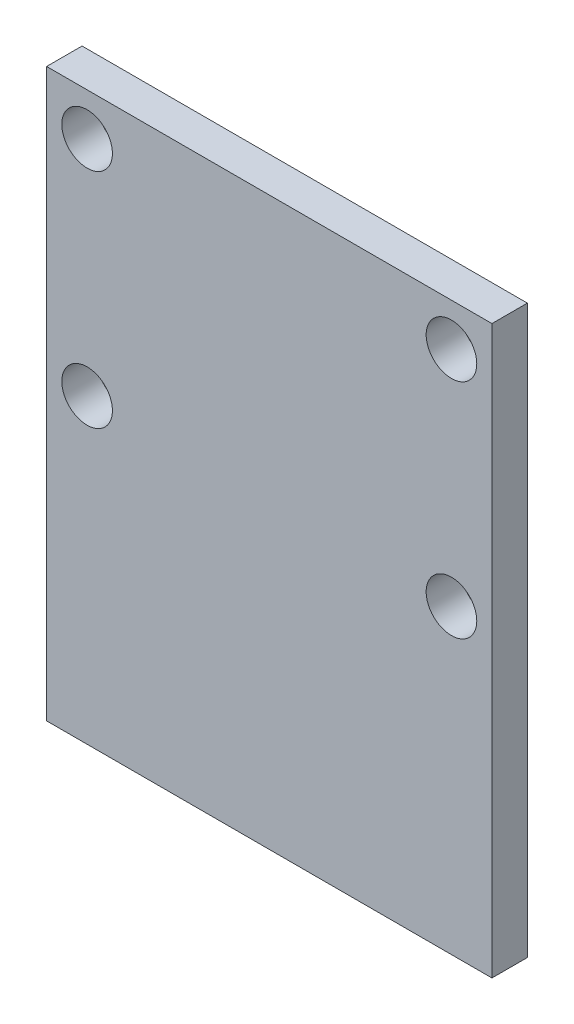
ISO-10303-21;
HEADER;
FILE_DESCRIPTION(('STEP AP214'),'2;1');
FILE_NAME('part.step','',(''),(''),'','','');
FILE_SCHEMA(('AUTOMOTIVE_DESIGN { 1 0 10303 214 1 1 1 1 }'));
ENDSEC;
DATA;
#1=APPLICATION_CONTEXT('core data for automotive mechanical design processes');
#2=APPLICATION_PROTOCOL_DEFINITION('international standard','automotive_design',2000,#1);
#3=PRODUCT_CONTEXT('',#1,'mechanical');
#4=PRODUCT('Part','Part','',(#3));
#5=PRODUCT_RELATED_PRODUCT_CATEGORY('part','',(#4));
#6=PRODUCT_DEFINITION_FORMATION('','',#4);
#7=PRODUCT_DEFINITION_CONTEXT('part definition',#1,'design');
#8=PRODUCT_DEFINITION('design','',#6,#7);
#9=PRODUCT_DEFINITION_SHAPE('','',#8);
#10=(LENGTH_UNIT() NAMED_UNIT(*) SI_UNIT(.MILLI.,.METRE.));
#11=(NAMED_UNIT(*) PLANE_ANGLE_UNIT() SI_UNIT($,.RADIAN.));
#12=(NAMED_UNIT(*) SI_UNIT($,.STERADIAN.) SOLID_ANGLE_UNIT());
#13=UNCERTAINTY_MEASURE_WITH_UNIT(LENGTH_MEASURE(1.E-05),#10,'distance_accuracy_value','');
#14=(GEOMETRIC_REPRESENTATION_CONTEXT(3) GLOBAL_UNCERTAINTY_ASSIGNED_CONTEXT((#13)) GLOBAL_UNIT_ASSIGNED_CONTEXT((#10,
#11,#12)) REPRESENTATION_CONTEXT('',''));
#15=CARTESIAN_POINT('',(0.,0.,0.));
#16=DIRECTION('',(0.,0.,1.));
#17=DIRECTION('',(1.,0.,0.));
#18=AXIS2_PLACEMENT_3D('',#15,#16,#17);
#19=CARTESIAN_POINT('',(0.,0.,1.75));
#20=DIRECTION('',(0.,1.,0.));
#21=DIRECTION('',(0.,0.,1.));
#22=AXIS2_PLACEMENT_3D('',#19,#20,#21);
#23=PLANE('',#22);
#24=DIRECTION('',(1.,0.,0.));
#25=VECTOR('',#24,1.);
#26=CARTESIAN_POINT('',(0.,0.,0.));
#27=LINE('',#26,#25);
#28=CARTESIAN_POINT('',(0.,0.,0.));
#29=VERTEX_POINT('',#28);
#30=CARTESIAN_POINT('',(22.,0.,0.));
#31=VERTEX_POINT('',#30);
#32=EDGE_CURVE('E112',#29,#31,#27,.T.);
#33=ORIENTED_EDGE('',*,*,#32,.T.);
#34=DIRECTION('',(0.,0.,-1.));
#35=VECTOR('',#34,1.);
#36=CARTESIAN_POINT('',(22.,0.,1.75));
#37=LINE('',#36,#35);
#38=CARTESIAN_POINT('',(22.,0.,1.75));
#39=VERTEX_POINT('',#38);
#40=EDGE_CURVE('E41',#39,#31,#37,.T.);
#41=ORIENTED_EDGE('',*,*,#40,.F.);
#42=DIRECTION('',(1.,0.,0.));
#43=VECTOR('',#42,1.);
#44=CARTESIAN_POINT('',(0.,0.,1.75));
#45=LINE('',#44,#43);
#46=CARTESIAN_POINT('',(0.,0.,1.75));
#47=VERTEX_POINT('',#46);
#48=EDGE_CURVE('E83',#47,#39,#45,.T.);
#49=ORIENTED_EDGE('',*,*,#48,.F.);
#50=DIRECTION('',(0.,0.,-1.));
#51=VECTOR('',#50,1.);
#52=CARTESIAN_POINT('',(0.,0.,1.75));
#53=LINE('',#52,#51);
#54=EDGE_CURVE('E49',#47,#29,#53,.T.);
#55=ORIENTED_EDGE('',*,*,#54,.T.);
#56=EDGE_LOOP('',(#33,#41,#49,#55));
#57=FACE_BOUND('',#56,.T.);
#58=ADVANCED_FACE('F32',(#57),#23,.F.);
#59=CARTESIAN_POINT('',(22.,0.,1.75));
#60=DIRECTION('',(-1.,0.,0.));
#61=DIRECTION('',(0.,0.,1.));
#62=AXIS2_PLACEMENT_3D('',#59,#60,#61);
#63=PLANE('',#62);
#64=DIRECTION('',(0.,1.,0.));
#65=VECTOR('',#64,1.);
#66=CARTESIAN_POINT('',(22.,0.,0.));
#67=LINE('',#66,#65);
#68=CARTESIAN_POINT('',(22.,28.,0.));
#69=VERTEX_POINT('',#68);
#70=EDGE_CURVE('E89',#31,#69,#67,.T.);
#71=ORIENTED_EDGE('',*,*,#70,.T.);
#72=DIRECTION('',(0.,0.,-1.));
#73=VECTOR('',#72,1.);
#74=CARTESIAN_POINT('',(22.,28.,1.75));
#75=LINE('',#74,#73);
#76=CARTESIAN_POINT('',(22.,28.,1.75));
#77=VERTEX_POINT('',#76);
#78=EDGE_CURVE('E87',#77,#69,#75,.T.);
#79=ORIENTED_EDGE('',*,*,#78,.F.);
#80=DIRECTION('',(0.,1.,0.));
#81=VECTOR('',#80,1.);
#82=CARTESIAN_POINT('',(22.,0.,1.75));
#83=LINE('',#82,#81);
#84=EDGE_CURVE('E75',#39,#77,#83,.T.);
#85=ORIENTED_EDGE('',*,*,#84,.F.);
#86=ORIENTED_EDGE('',*,*,#40,.T.);
#87=EDGE_LOOP('',(#71,#79,#85,#86));
#88=FACE_BOUND('',#87,.T.);
#89=ADVANCED_FACE('F88',(#88),#63,.F.);
#90=CARTESIAN_POINT('',(0.,28.,1.75));
#91=DIRECTION('',(0.,1.,0.));
#92=DIRECTION('',(0.,0.,1.));
#93=AXIS2_PLACEMENT_3D('',#90,#91,#92);
#94=PLANE('',#93);
#95=DIRECTION('',(1.,0.,0.));
#96=VECTOR('',#95,1.);
#97=CARTESIAN_POINT('',(0.,28.,0.));
#98=LINE('',#97,#96);
#99=CARTESIAN_POINT('',(0.,28.,0.));
#100=VERTEX_POINT('',#99);
#101=EDGE_CURVE('E115',#100,#69,#98,.T.);
#102=ORIENTED_EDGE('',*,*,#101,.F.);
#103=DIRECTION('',(0.,0.,-1.));
#104=VECTOR('',#103,1.);
#105=CARTESIAN_POINT('',(0.,28.,1.75));
#106=LINE('',#105,#104);
#107=CARTESIAN_POINT('',(0.,28.,1.75));
#108=VERTEX_POINT('',#107);
#109=EDGE_CURVE('E63',#108,#100,#106,.T.);
#110=ORIENTED_EDGE('',*,*,#109,.F.);
#111=DIRECTION('',(1.,0.,0.));
#112=VECTOR('',#111,1.);
#113=CARTESIAN_POINT('',(0.,28.,1.75));
#114=LINE('',#113,#112);
#115=EDGE_CURVE('E82',#108,#77,#114,.T.);
#116=ORIENTED_EDGE('',*,*,#115,.T.);
#117=ORIENTED_EDGE('',*,*,#78,.T.);
#118=EDGE_LOOP('',(#102,#110,#116,#117));
#119=FACE_BOUND('',#118,.T.);
#120=ADVANCED_FACE('F93',(#119),#94,.T.);
#121=CARTESIAN_POINT('',(20.,14.9,1.75));
#122=DIRECTION('',(0.,0.,-1.));
#123=DIRECTION('',(-1.,0.,0.));
#124=AXIS2_PLACEMENT_3D('',#121,#122,#123);
#125=CYLINDRICAL_SURFACE('',#124,1.25);
#126=CARTESIAN_POINT('',(20.,14.9,1.75));
#127=DIRECTION('',(0.,0.,1.));
#128=DIRECTION('',(1.,0.,0.));
#129=AXIS2_PLACEMENT_3D('',#126,#127,#128);
#130=CIRCLE('',#129,1.25);
#131=CARTESIAN_POINT('',(21.25,14.9,1.75));
#132=VERTEX_POINT('',#131);
#133=EDGE_CURVE('E193',#132,#132,#130,.T.);
#134=ORIENTED_EDGE('',*,*,#133,.T.);
#135=EDGE_LOOP('',(#134));
#136=FACE_BOUND('',#135,.T.);
#137=CARTESIAN_POINT('',(20.,14.9,0.));
#138=DIRECTION('',(0.,0.,1.));
#139=DIRECTION('',(1.,0.,0.));
#140=AXIS2_PLACEMENT_3D('',#137,#138,#139);
#141=CIRCLE('',#140,1.25);
#142=CARTESIAN_POINT('',(21.25,14.9,0.));
#143=VERTEX_POINT('',#142);
#144=EDGE_CURVE('E109',#143,#143,#141,.T.);
#145=ORIENTED_EDGE('',*,*,#144,.F.);
#146=EDGE_LOOP('',(#145));
#147=FACE_BOUND('',#146,.T.);
#148=ADVANCED_FACE('F144',(#136,#147),#125,.F.);
#149=CARTESIAN_POINT('',(2.,14.9,1.75));
#150=DIRECTION('',(0.,0.,-1.));
#151=DIRECTION('',(-1.,0.,0.));
#152=AXIS2_PLACEMENT_3D('',#149,#150,#151);
#153=CYLINDRICAL_SURFACE('',#152,1.25);
#154=CARTESIAN_POINT('',(2.,14.9,1.75));
#155=DIRECTION('',(0.,0.,1.));
#156=DIRECTION('',(1.,0.,0.));
#157=AXIS2_PLACEMENT_3D('',#154,#155,#156);
#158=CIRCLE('',#157,1.25);
#159=CARTESIAN_POINT('',(3.25,14.9,1.75));
#160=VERTEX_POINT('',#159);
#161=EDGE_CURVE('E190',#160,#160,#158,.T.);
#162=ORIENTED_EDGE('',*,*,#161,.T.);
#163=EDGE_LOOP('',(#162));
#164=FACE_BOUND('',#163,.T.);
#165=CARTESIAN_POINT('',(2.,14.9,0.));
#166=DIRECTION('',(0.,0.,1.));
#167=DIRECTION('',(1.,0.,0.));
#168=AXIS2_PLACEMENT_3D('',#165,#166,#167);
#169=CIRCLE('',#168,1.25);
#170=CARTESIAN_POINT('',(3.25,14.9,0.));
#171=VERTEX_POINT('',#170);
#172=EDGE_CURVE('E106',#171,#171,#169,.T.);
#173=ORIENTED_EDGE('',*,*,#172,.F.);
#174=EDGE_LOOP('',(#173));
#175=FACE_BOUND('',#174,.T.);
#176=ADVANCED_FACE('F147',(#164,#175),#153,.F.);
#177=CARTESIAN_POINT('',(20.,25.9,1.75));
#178=DIRECTION('',(0.,0.,-1.));
#179=DIRECTION('',(-1.,0.,0.));
#180=AXIS2_PLACEMENT_3D('',#177,#178,#179);
#181=CYLINDRICAL_SURFACE('',#180,1.25);
#182=CARTESIAN_POINT('',(20.,25.9,1.75));
#183=DIRECTION('',(0.,0.,1.));
#184=DIRECTION('',(1.,0.,0.));
#185=AXIS2_PLACEMENT_3D('',#182,#183,#184);
#186=CIRCLE('',#185,1.25);
#187=CARTESIAN_POINT('',(21.25,25.9,1.75));
#188=VERTEX_POINT('',#187);
#189=EDGE_CURVE('E158',#188,#188,#186,.T.);
#190=ORIENTED_EDGE('',*,*,#189,.T.);
#191=EDGE_LOOP('',(#190));
#192=FACE_BOUND('',#191,.T.);
#193=CARTESIAN_POINT('',(20.,25.9,0.));
#194=DIRECTION('',(0.,0.,1.));
#195=DIRECTION('',(1.,0.,0.));
#196=AXIS2_PLACEMENT_3D('',#193,#194,#195);
#197=CIRCLE('',#196,1.25);
#198=CARTESIAN_POINT('',(21.25,25.9,0.));
#199=VERTEX_POINT('',#198);
#200=EDGE_CURVE('E102',#199,#199,#197,.T.);
#201=ORIENTED_EDGE('',*,*,#200,.F.);
#202=EDGE_LOOP('',(#201));
#203=FACE_BOUND('',#202,.T.);
#204=ADVANCED_FACE('F133',(#192,#203),#181,.F.);
#205=CARTESIAN_POINT('',(2.,25.9,1.75));
#206=DIRECTION('',(0.,0.,-1.));
#207=DIRECTION('',(-1.,0.,0.));
#208=AXIS2_PLACEMENT_3D('',#205,#206,#207);
#209=CYLINDRICAL_SURFACE('',#208,1.25);
#210=CARTESIAN_POINT('',(2.,25.9,1.75));
#211=DIRECTION('',(0.,0.,1.));
#212=DIRECTION('',(1.,0.,0.));
#213=AXIS2_PLACEMENT_3D('',#210,#211,#212);
#214=CIRCLE('',#213,1.25);
#215=CARTESIAN_POINT('',(3.25,25.9,1.75));
#216=VERTEX_POINT('',#215);
#217=EDGE_CURVE('E120',#216,#216,#214,.T.);
#218=ORIENTED_EDGE('',*,*,#217,.T.);
#219=EDGE_LOOP('',(#218));
#220=FACE_BOUND('',#219,.T.);
#221=CARTESIAN_POINT('',(2.,25.9,0.));
#222=DIRECTION('',(0.,0.,1.));
#223=DIRECTION('',(1.,0.,0.));
#224=AXIS2_PLACEMENT_3D('',#221,#222,#223);
#225=CIRCLE('',#224,1.25);
#226=CARTESIAN_POINT('',(3.25,25.9,0.));
#227=VERTEX_POINT('',#226);
#228=EDGE_CURVE('E99',#227,#227,#225,.T.);
#229=ORIENTED_EDGE('',*,*,#228,.F.);
#230=EDGE_LOOP('',(#229));
#231=FACE_BOUND('',#230,.T.);
#232=ADVANCED_FACE('F34',(#220,#231),#209,.F.);
#233=CARTESIAN_POINT('',(0.,0.,1.75));
#234=DIRECTION('',(-1.,0.,0.));
#235=DIRECTION('',(0.,0.,1.));
#236=AXIS2_PLACEMENT_3D('',#233,#234,#235);
#237=PLANE('',#236);
#238=DIRECTION('',(0.,1.,0.));
#239=VECTOR('',#238,1.);
#240=CARTESIAN_POINT('',(0.,0.,0.));
#241=LINE('',#240,#239);
#242=EDGE_CURVE('E117',#29,#100,#241,.T.);
#243=ORIENTED_EDGE('',*,*,#242,.F.);
#244=ORIENTED_EDGE('',*,*,#54,.F.);
#245=DIRECTION('',(0.,1.,0.));
#246=VECTOR('',#245,1.);
#247=CARTESIAN_POINT('',(0.,0.,1.75));
#248=LINE('',#247,#246);
#249=EDGE_CURVE('E94',#47,#108,#248,.T.);
#250=ORIENTED_EDGE('',*,*,#249,.T.);
#251=ORIENTED_EDGE('',*,*,#109,.T.);
#252=EDGE_LOOP('',(#243,#244,#250,#251));
#253=FACE_BOUND('',#252,.T.);
#254=ADVANCED_FACE('F124',(#253),#237,.T.);
#255=CARTESIAN_POINT('',(0.,0.,1.75));
#256=DIRECTION('',(0.,0.,1.));
#257=DIRECTION('',(1.,0.,0.));
#258=AXIS2_PLACEMENT_3D('',#255,#256,#257);
#259=PLANE('',#258);
#260=ORIENTED_EDGE('',*,*,#217,.F.);
#261=EDGE_LOOP('',(#260));
#262=FACE_BOUND('',#261,.T.);
#263=ORIENTED_EDGE('',*,*,#189,.F.);
#264=EDGE_LOOP('',(#263));
#265=FACE_BOUND('',#264,.T.);
#266=ORIENTED_EDGE('',*,*,#161,.F.);
#267=EDGE_LOOP('',(#266));
#268=FACE_BOUND('',#267,.T.);
#269=ORIENTED_EDGE('',*,*,#133,.F.);
#270=EDGE_LOOP('',(#269));
#271=FACE_BOUND('',#270,.T.);
#272=ORIENTED_EDGE('',*,*,#48,.T.);
#273=ORIENTED_EDGE('',*,*,#84,.T.);
#274=ORIENTED_EDGE('',*,*,#115,.F.);
#275=ORIENTED_EDGE('',*,*,#249,.F.);
#276=EDGE_LOOP('',(#272,#273,#274,#275));
#277=FACE_BOUND('',#276,.T.);
#278=ADVANCED_FACE('F79',(#262,#265,#268,#271,#277),#259,.T.);
#279=CARTESIAN_POINT('',(0.,0.,0.));
#280=DIRECTION('',(0.,0.,1.));
#281=DIRECTION('',(1.,0.,0.));
#282=AXIS2_PLACEMENT_3D('',#279,#280,#281);
#283=PLANE('',#282);
#284=CARTESIAN_POINT('',(11.,20.4,0.));
#285=DIRECTION('',(0.,0.,1.));
#286=DIRECTION('',(1.,0.,0.));
#287=AXIS2_PLACEMENT_3D('',#284,#285,#286);
#288=CIRCLE('',#287,1.);
#289=CARTESIAN_POINT('',(12.,20.4,0.));
#290=VERTEX_POINT('',#289);
#291=EDGE_CURVE('E11',#290,#290,#288,.F.);
#292=ORIENTED_EDGE('',*,*,#291,.F.);
#293=EDGE_LOOP('',(#292));
#294=FACE_BOUND('',#293,.T.);
#295=ORIENTED_EDGE('',*,*,#228,.T.);
#296=EDGE_LOOP('',(#295));
#297=FACE_BOUND('',#296,.T.);
#298=ORIENTED_EDGE('',*,*,#200,.T.);
#299=EDGE_LOOP('',(#298));
#300=FACE_BOUND('',#299,.T.);
#301=ORIENTED_EDGE('',*,*,#172,.T.);
#302=EDGE_LOOP('',(#301));
#303=FACE_BOUND('',#302,.T.);
#304=ORIENTED_EDGE('',*,*,#144,.T.);
#305=EDGE_LOOP('',(#304));
#306=FACE_BOUND('',#305,.T.);
#307=ORIENTED_EDGE('',*,*,#32,.F.);
#308=ORIENTED_EDGE('',*,*,#242,.T.);
#309=ORIENTED_EDGE('',*,*,#101,.T.);
#310=ORIENTED_EDGE('',*,*,#70,.F.);
#311=EDGE_LOOP('',(#307,#308,#309,#310));
#312=FACE_BOUND('',#311,.T.);
#313=ADVANCED_FACE('F123',(#294,#297,#300,#303,#306,#312),#283,.F.);
#314=CARTESIAN_POINT('',(11.,20.4,-1.25));
#315=DIRECTION('',(0.,0.,1.));
#316=DIRECTION('',(1.,0.,0.));
#317=AXIS2_PLACEMENT_3D('',#314,#315,#316);
#318=CYLINDRICAL_SURFACE('',#317,1.);
#319=CARTESIAN_POINT('',(11.,20.4,-1.25));
#320=DIRECTION('',(0.,0.,-1.));
#321=DIRECTION('',(-1.,0.,0.));
#322=AXIS2_PLACEMENT_3D('',#319,#320,#321);
#323=CIRCLE('',#322,1.);
#324=CARTESIAN_POINT('',(10.,20.4,-1.25));
#325=VERTEX_POINT('',#324);
#326=EDGE_CURVE('E103',#325,#325,#323,.T.);
#327=ORIENTED_EDGE('',*,*,#326,.F.);
#328=EDGE_LOOP('',(#327));
#329=FACE_BOUND('',#328,.T.);
#330=ORIENTED_EDGE('',*,*,#291,.T.);
#331=EDGE_LOOP('',(#330));
#332=FACE_BOUND('',#331,.T.);
#333=ADVANCED_FACE('F163',(#329,#332),#318,.T.);
#334=CARTESIAN_POINT('',(11.,20.4,-1.25));
#335=DIRECTION('',(0.,0.,-1.));
#336=DIRECTION('',(-1.,0.,0.));
#337=AXIS2_PLACEMENT_3D('',#334,#335,#336);
#338=PLANE('',#337);
#339=ORIENTED_EDGE('',*,*,#326,.T.);
#340=EDGE_LOOP('',(#339));
#341=FACE_BOUND('',#340,.T.);
#342=ADVANCED_FACE('F173',(#341),#338,.T.);
#343=CLOSED_SHELL('',(#58,#89,#120,#148,#176,#204,#232,#254,#278,#313,#333,#342));
#344=MANIFOLD_SOLID_BREP('B2',#343);
#345=ADVANCED_BREP_SHAPE_REPRESENTATION('',(#18,#344),#14);
#346=SHAPE_DEFINITION_REPRESENTATION(#9,#345);
ENDSEC;
END-ISO-10303-21;
